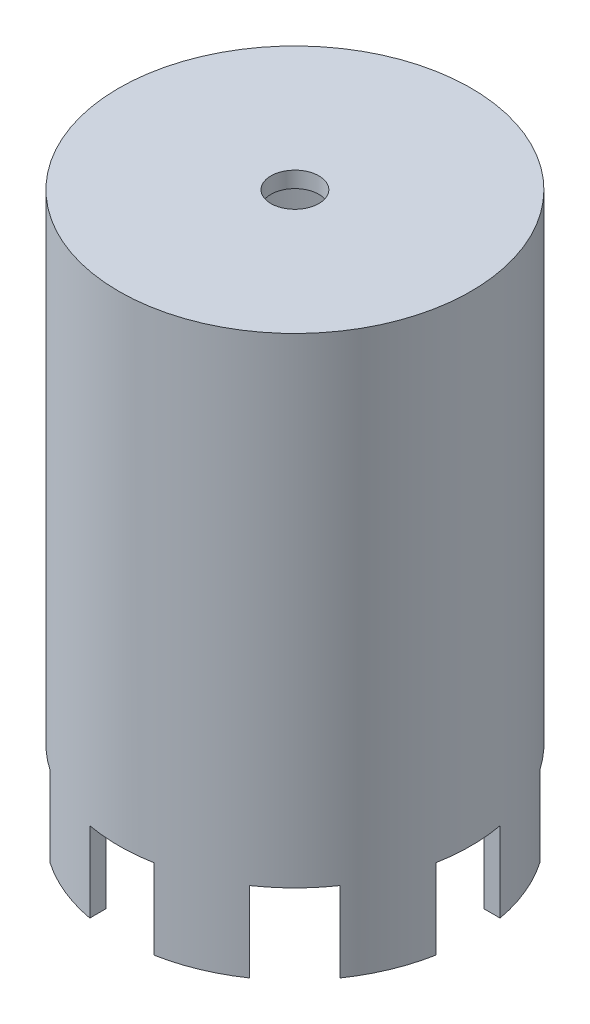
ISO-10303-21;
HEADER;
FILE_DESCRIPTION(('STEP AP214'),'2;1');
FILE_NAME('part.step','',(''),(''),'','','');
FILE_SCHEMA(('AUTOMOTIVE_DESIGN { 1 0 10303 214 1 1 1 1 }'));
ENDSEC;
DATA;
#1=APPLICATION_CONTEXT('core data for automotive mechanical design processes');
#2=APPLICATION_PROTOCOL_DEFINITION('international standard','automotive_design',2000,#1);
#3=PRODUCT_CONTEXT('',#1,'mechanical');
#4=PRODUCT('Part','Part','',(#3));
#5=PRODUCT_RELATED_PRODUCT_CATEGORY('part','',(#4));
#6=PRODUCT_DEFINITION_FORMATION('','',#4);
#7=PRODUCT_DEFINITION_CONTEXT('part definition',#1,'design');
#8=PRODUCT_DEFINITION('design','',#6,#7);
#9=PRODUCT_DEFINITION_SHAPE('','',#8);
#10=(LENGTH_UNIT() NAMED_UNIT(*) SI_UNIT(.MILLI.,.METRE.));
#11=(NAMED_UNIT(*) PLANE_ANGLE_UNIT() SI_UNIT($,.RADIAN.));
#12=(NAMED_UNIT(*) SI_UNIT($,.STERADIAN.) SOLID_ANGLE_UNIT());
#13=UNCERTAINTY_MEASURE_WITH_UNIT(LENGTH_MEASURE(1.E-05),#10,'distance_accuracy_value','');
#14=(GEOMETRIC_REPRESENTATION_CONTEXT(3) GLOBAL_UNCERTAINTY_ASSIGNED_CONTEXT((#13)) GLOBAL_UNIT_ASSIGNED_CONTEXT((#10,
#11,#12)) REPRESENTATION_CONTEXT('',''));
#15=CARTESIAN_POINT('',(0.,0.,0.));
#16=DIRECTION('',(0.,0.,1.));
#17=DIRECTION('',(1.,0.,0.));
#18=AXIS2_PLACEMENT_3D('',#15,#16,#17);
#19=CARTESIAN_POINT('',(0.,0.,0.));
#20=DIRECTION('',(0.,1.,0.));
#21=DIRECTION('',(0.,0.,1.));
#22=AXIS2_PLACEMENT_3D('',#19,#20,#21);
#23=PLANE('',#22);
#24=CARTESIAN_POINT('',(0.,0.,0.));
#25=DIRECTION('',(0.,1.,0.));
#26=DIRECTION('',(0.,0.,1.));
#27=AXIS2_PLACEMENT_3D('',#24,#25,#26);
#28=CIRCLE('',#27,10.);
#29=CARTESIAN_POINT('',(1.99999999999996,0.,9.79795897113272));
#30=VERTEX_POINT('',#29);
#31=CARTESIAN_POINT('',(5.51398966790239,0.,8.34241679264862));
#32=VERTEX_POINT('',#31);
#33=EDGE_CURVE('E270',#30,#32,#28,.T.);
#34=ORIENTED_EDGE('',*,*,#33,.T.);
#35=DIRECTION('',(0.707106781186546,0.,0.707106781186549));
#36=VECTOR('',#35,1.);
#37=CARTESIAN_POINT('',(-12.4142135623731,0.,-9.58578643762693));
#38=LINE('',#37,#36);
#39=CARTESIAN_POINT('',(6.23431570801606,0.,9.06274283276229));
#40=VERTEX_POINT('',#39);
#41=EDGE_CURVE('E248',#32,#40,#38,.T.);
#42=ORIENTED_EDGE('',*,*,#41,.T.);
#43=CARTESIAN_POINT('',(0.,0.,0.));
#44=DIRECTION('',(0.,1.,0.));
#45=DIRECTION('',(0.,0.,1.));
#46=AXIS2_PLACEMENT_3D('',#43,#44,#45);
#47=CIRCLE('',#46,11.);
#48=CARTESIAN_POINT('',(1.99999999999996,0.,10.816653826392));
#49=VERTEX_POINT('',#48);
#50=EDGE_CURVE('E482',#49,#40,#47,.T.);
#51=ORIENTED_EDGE('',*,*,#50,.F.);
#52=DIRECTION('',(0.,0.,1.));
#53=VECTOR('',#52,1.);
#54=CARTESIAN_POINT('',(2.00000000000003,0.,-11.));
#55=LINE('',#54,#53);
#56=EDGE_CURVE('E276',#30,#49,#55,.T.);
#57=ORIENTED_EDGE('',*,*,#56,.F.);
#58=EDGE_LOOP('',(#34,#42,#51,#57));
#59=FACE_BOUND('',#58,.T.);
#60=ADVANCED_FACE('F41',(#59),#23,.F.);
#61=CARTESIAN_POINT('',(-5.51398966790247,0.,8.34241679264858));
#62=VERTEX_POINT('',#61);
#63=CARTESIAN_POINT('',(-2.00000000000004,0.,9.7979589711327));
#64=VERTEX_POINT('',#63);
#65=EDGE_CURVE('E277',#62,#64,#28,.T.);
#66=ORIENTED_EDGE('',*,*,#65,.T.);
#67=DIRECTION('',(0.,0.,1.));
#68=VECTOR('',#67,1.);
#69=CARTESIAN_POINT('',(-1.99999999999997,0.,-11.0000000000001));
#70=LINE('',#69,#68);
#71=CARTESIAN_POINT('',(-2.00000000000004,0.,10.816653826392));
#72=VERTEX_POINT('',#71);
#73=EDGE_CURVE('E455',#64,#72,#70,.T.);
#74=ORIENTED_EDGE('',*,*,#73,.T.);
#75=CARTESIAN_POINT('',(-6.23431570801614,0.,9.06274283276225));
#76=VERTEX_POINT('',#75);
#77=EDGE_CURVE('E300',#76,#72,#47,.T.);
#78=ORIENTED_EDGE('',*,*,#77,.F.);
#79=DIRECTION('',(-0.707106781186551,0.,0.707106781186544));
#80=VECTOR('',#79,1.);
#81=CARTESIAN_POINT('',(12.4142135623731,0.,-9.58578643762684));
#82=LINE('',#81,#80);
#83=EDGE_CURVE('E435',#62,#76,#82,.T.);
#84=ORIENTED_EDGE('',*,*,#83,.F.);
#85=EDGE_LOOP('',(#66,#74,#78,#84));
#86=FACE_BOUND('',#85,.T.);
#87=ADVANCED_FACE('F512',(#86),#23,.F.);
#88=CARTESIAN_POINT('',(-9.79795897113271,0.,2.00000000000001));
#89=VERTEX_POINT('',#88);
#90=CARTESIAN_POINT('',(-8.34241679264864,0.,5.51398966790237));
#91=VERTEX_POINT('',#90);
#92=EDGE_CURVE('E281',#89,#91,#28,.T.);
#93=ORIENTED_EDGE('',*,*,#92,.T.);
#94=DIRECTION('',(-0.707106781186551,0.,0.707106781186544));
#95=VECTOR('',#94,1.);
#96=CARTESIAN_POINT('',(9.58578643762697,0.,-12.4142135623731));
#97=LINE('',#96,#95);
#98=CARTESIAN_POINT('',(-9.06274283276232,0.,6.23431570801604));
#99=VERTEX_POINT('',#98);
#100=EDGE_CURVE('E428',#91,#99,#97,.T.);
#101=ORIENTED_EDGE('',*,*,#100,.T.);
#102=CARTESIAN_POINT('',(-10.816653826392,0.,2.00000000000001));
#103=VERTEX_POINT('',#102);
#104=EDGE_CURVE('E296',#103,#99,#47,.T.);
#105=ORIENTED_EDGE('',*,*,#104,.F.);
#106=DIRECTION('',(1.,0.,0.));
#107=VECTOR('',#106,1.);
#108=CARTESIAN_POINT('',(-11.,0.,2.00000000000001));
#109=LINE('',#108,#107);
#110=EDGE_CURVE('E401',#103,#89,#109,.T.);
#111=ORIENTED_EDGE('',*,*,#110,.T.);
#112=EDGE_LOOP('',(#93,#101,#105,#111));
#113=FACE_BOUND('',#112,.T.);
#114=ADVANCED_FACE('F426',(#113),#23,.F.);
#115=CARTESIAN_POINT('',(-9.06274283276226,0.,-6.23431570801609));
#116=VERTEX_POINT('',#115);
#117=CARTESIAN_POINT('',(-10.816653826392,0.,-2.));
#118=VERTEX_POINT('',#117);
#119=EDGE_CURVE('E299',#116,#118,#47,.T.);
#120=ORIENTED_EDGE('',*,*,#119,.F.);
#121=CARTESIAN_POINT('',(-8.3424167926486,0.,-5.51398966790242));
#122=VERTEX_POINT('',#121);
#123=EDGE_CURVE('E260',#116,#122,#38,.T.);
#124=ORIENTED_EDGE('',*,*,#123,.T.);
#125=CARTESIAN_POINT('',(-9.79795897113271,0.,-2.));
#126=VERTEX_POINT('',#125);
#127=EDGE_CURVE('E288',#122,#126,#28,.T.);
#128=ORIENTED_EDGE('',*,*,#127,.T.);
#129=DIRECTION('',(1.,0.,0.));
#130=VECTOR('',#129,1.);
#131=CARTESIAN_POINT('',(-11.,0.,-2.));
#132=LINE('',#131,#130);
#133=EDGE_CURVE('E398',#118,#126,#132,.T.);
#134=ORIENTED_EDGE('',*,*,#133,.F.);
#135=EDGE_LOOP('',(#120,#124,#128,#134));
#136=FACE_BOUND('',#135,.T.);
#137=ADVANCED_FACE('F463',(#136),#23,.F.);
#138=CARTESIAN_POINT('',(9.79795897113271,0.,-2.));
#139=VERTEX_POINT('',#138);
#140=CARTESIAN_POINT('',(8.34241679264863,0.,-5.51398966790237));
#141=VERTEX_POINT('',#140);
#142=EDGE_CURVE('E282',#139,#141,#28,.T.);
#143=ORIENTED_EDGE('',*,*,#142,.T.);
#144=CARTESIAN_POINT('',(9.0627428327623,0.,-6.23431570801604));
#145=VERTEX_POINT('',#144);
#146=EDGE_CURVE('E441',#145,#141,#82,.T.);
#147=ORIENTED_EDGE('',*,*,#146,.F.);
#148=CARTESIAN_POINT('',(10.816653826392,0.,-2.));
#149=VERTEX_POINT('',#148);
#150=EDGE_CURVE('E295',#149,#145,#47,.T.);
#151=ORIENTED_EDGE('',*,*,#150,.F.);
#152=EDGE_CURVE('E399',#139,#149,#132,.T.);
#153=ORIENTED_EDGE('',*,*,#152,.F.);
#154=EDGE_LOOP('',(#143,#147,#151,#153));
#155=FACE_BOUND('',#154,.T.);
#156=ADVANCED_FACE('F498',(#155),#23,.F.);
#157=CARTESIAN_POINT('',(6.23431570801612,0.,-9.06274283276224));
#158=VERTEX_POINT('',#157);
#159=CARTESIAN_POINT('',(2.00000000000003,0.,-10.816653826392));
#160=VERTEX_POINT('',#159);
#161=EDGE_CURVE('E490',#158,#160,#47,.T.);
#162=ORIENTED_EDGE('',*,*,#161,.F.);
#163=CARTESIAN_POINT('',(5.51398966790245,0.,-8.34241679264858));
#164=VERTEX_POINT('',#163);
#165=EDGE_CURVE('E431',#158,#164,#97,.T.);
#166=ORIENTED_EDGE('',*,*,#165,.T.);
#167=CARTESIAN_POINT('',(2.00000000000003,0.,-9.79795897113271));
#168=VERTEX_POINT('',#167);
#169=EDGE_CURVE('E284',#164,#168,#28,.T.);
#170=ORIENTED_EDGE('',*,*,#169,.T.);
#171=EDGE_CURVE('E450',#160,#168,#55,.T.);
#172=ORIENTED_EDGE('',*,*,#171,.F.);
#173=EDGE_LOOP('',(#162,#166,#170,#172));
#174=FACE_BOUND('',#173,.T.);
#175=ADVANCED_FACE('F541',(#174),#23,.F.);
#176=CARTESIAN_POINT('',(9.06274283276226,0.,6.2343157080161));
#177=VERTEX_POINT('',#176);
#178=CARTESIAN_POINT('',(10.816653826392,0.,2.00000000000001));
#179=VERTEX_POINT('',#178);
#180=EDGE_CURVE('E301',#177,#179,#47,.T.);
#181=ORIENTED_EDGE('',*,*,#180,.F.);
#182=DIRECTION('',(0.707106781186546,0.,0.707106781186549));
#183=VECTOR('',#182,1.);
#184=CARTESIAN_POINT('',(-9.58578643762689,0.,-12.4142135623731));
#185=LINE('',#184,#183);
#186=CARTESIAN_POINT('',(8.34241679264859,0.,5.51398966790243));
#187=VERTEX_POINT('',#186);
#188=EDGE_CURVE('E458',#187,#177,#185,.T.);
#189=ORIENTED_EDGE('',*,*,#188,.F.);
#190=CARTESIAN_POINT('',(9.79795897113271,0.,2.00000000000001));
#191=VERTEX_POINT('',#190);
#192=EDGE_CURVE('E278',#187,#191,#28,.T.);
#193=ORIENTED_EDGE('',*,*,#192,.T.);
#194=EDGE_CURVE('E389',#191,#179,#109,.T.);
#195=ORIENTED_EDGE('',*,*,#194,.T.);
#196=EDGE_LOOP('',(#181,#189,#193,#195));
#197=FACE_BOUND('',#196,.T.);
#198=ADVANCED_FACE('F537',(#197),#23,.F.);
#199=CARTESIAN_POINT('',(0.,35.,0.));
#200=DIRECTION('',(0.,-1.,0.));
#201=DIRECTION('',(0.,0.,-1.));
#202=AXIS2_PLACEMENT_3D('',#199,#200,#201);
#203=CYLINDRICAL_SURFACE('',#202,11.);
#204=CARTESIAN_POINT('',(0.,35.,0.));
#205=DIRECTION('',(0.,1.,0.));
#206=DIRECTION('',(0.,0.,1.));
#207=AXIS2_PLACEMENT_3D('',#204,#205,#206);
#208=CIRCLE('',#207,11.);
#209=CARTESIAN_POINT('',(0.,35.,11.));
#210=VERTEX_POINT('',#209);
#211=EDGE_CURVE('E291',#210,#210,#208,.T.);
#212=ORIENTED_EDGE('',*,*,#211,.F.);
#213=EDGE_LOOP('',(#212));
#214=FACE_BOUND('',#213,.T.);
#215=CARTESIAN_POINT('',(0.,5.,0.));
#216=DIRECTION('',(0.,1.,0.));
#217=DIRECTION('',(0.,0.,1.));
#218=AXIS2_PLACEMENT_3D('',#215,#216,#217);
#219=CIRCLE('',#218,11.);
#220=CARTESIAN_POINT('',(-6.23431570801607,5.,-9.06274283276228));
#221=VERTEX_POINT('',#220);
#222=CARTESIAN_POINT('',(-9.06274283276227,5.,-6.23431570801609));
#223=VERTEX_POINT('',#222);
#224=EDGE_CURVE('E625',#221,#223,#219,.T.);
#225=ORIENTED_EDGE('',*,*,#224,.T.);
#226=DIRECTION('',(0.,-1.,0.));
#227=VECTOR('',#226,1.);
#228=CARTESIAN_POINT('',(-9.06274283276226,35.,-6.2343157080161));
#229=LINE('',#228,#227);
#230=EDGE_CURVE('E386',#223,#116,#229,.T.);
#231=ORIENTED_EDGE('',*,*,#230,.T.);
#232=ORIENTED_EDGE('',*,*,#119,.T.);
#233=DIRECTION('',(0.,-1.,0.));
#234=VECTOR('',#233,1.);
#235=CARTESIAN_POINT('',(-10.816653826392,35.,-1.99999999999999));
#236=LINE('',#235,#234);
#237=CARTESIAN_POINT('',(-10.816653826392,5.,-2.));
#238=VERTEX_POINT('',#237);
#239=EDGE_CURVE('E404',#118,#238,#236,.F.);
#240=ORIENTED_EDGE('',*,*,#239,.T.);
#241=CARTESIAN_POINT('',(0.,5.,0.));
#242=DIRECTION('',(0.,1.,0.));
#243=DIRECTION('',(0.,0.,1.));
#244=AXIS2_PLACEMENT_3D('',#241,#242,#243);
#245=CIRCLE('',#244,11.);
#246=CARTESIAN_POINT('',(-10.816653826392,5.,2.));
#247=VERTEX_POINT('',#246);
#248=EDGE_CURVE('E410',#238,#247,#245,.T.);
#249=ORIENTED_EDGE('',*,*,#248,.T.);
#250=DIRECTION('',(0.,-1.,0.));
#251=VECTOR('',#250,1.);
#252=CARTESIAN_POINT('',(-10.816653826392,35.,2.));
#253=LINE('',#252,#251);
#254=EDGE_CURVE('E283',#247,#103,#253,.T.);
#255=ORIENTED_EDGE('',*,*,#254,.T.);
#256=ORIENTED_EDGE('',*,*,#104,.T.);
#257=DIRECTION('',(0.,-1.,0.));
#258=VECTOR('',#257,1.);
#259=CARTESIAN_POINT('',(-9.06274283276231,35.,6.23431570801604));
#260=LINE('',#259,#258);
#261=CARTESIAN_POINT('',(-9.06274283276232,5.,6.23431570801604));
#262=VERTEX_POINT('',#261);
#263=EDGE_CURVE('E359',#99,#262,#260,.F.);
#264=ORIENTED_EDGE('',*,*,#263,.T.);
#265=CARTESIAN_POINT('',(-6.23431570801614,5.,9.06274283276224));
#266=VERTEX_POINT('',#265);
#267=EDGE_CURVE('E354',#262,#266,#219,.T.);
#268=ORIENTED_EDGE('',*,*,#267,.T.);
#269=DIRECTION('',(0.,-1.,0.));
#270=VECTOR('',#269,1.);
#271=CARTESIAN_POINT('',(-6.23431570801614,35.,9.06274283276223));
#272=LINE('',#271,#270);
#273=EDGE_CURVE('E356',#266,#76,#272,.T.);
#274=ORIENTED_EDGE('',*,*,#273,.T.);
#275=ORIENTED_EDGE('',*,*,#77,.T.);
#276=DIRECTION('',(0.,-1.,0.));
#277=VECTOR('',#276,1.);
#278=CARTESIAN_POINT('',(-2.00000000000004,35.,10.816653826392));
#279=LINE('',#278,#277);
#280=CARTESIAN_POINT('',(-2.00000000000004,5.,10.816653826392));
#281=VERTEX_POINT('',#280);
#282=EDGE_CURVE('E365',#72,#281,#279,.F.);
#283=ORIENTED_EDGE('',*,*,#282,.T.);
#284=CARTESIAN_POINT('',(1.99999999999996,5.,10.816653826392));
#285=VERTEX_POINT('',#284);
#286=EDGE_CURVE('E351',#281,#285,#219,.T.);
#287=ORIENTED_EDGE('',*,*,#286,.T.);
#288=DIRECTION('',(0.,-1.,0.));
#289=VECTOR('',#288,1.);
#290=CARTESIAN_POINT('',(1.99999999999995,35.,10.816653826392));
#291=LINE('',#290,#289);
#292=EDGE_CURVE('E362',#285,#49,#291,.T.);
#293=ORIENTED_EDGE('',*,*,#292,.T.);
#294=ORIENTED_EDGE('',*,*,#50,.T.);
#295=DIRECTION('',(0.,-1.,0.));
#296=VECTOR('',#295,1.);
#297=CARTESIAN_POINT('',(6.23431570801607,35.,9.06274283276228));
#298=LINE('',#297,#296);
#299=CARTESIAN_POINT('',(6.23431570801606,5.,9.06274283276229));
#300=VERTEX_POINT('',#299);
#301=EDGE_CURVE('E255',#40,#300,#298,.F.);
#302=ORIENTED_EDGE('',*,*,#301,.T.);
#303=CARTESIAN_POINT('',(9.06274283276227,5.,6.23431570801611));
#304=VERTEX_POINT('',#303);
#305=EDGE_CURVE('E626',#300,#304,#219,.T.);
#306=ORIENTED_EDGE('',*,*,#305,.T.);
#307=DIRECTION('',(0.,-1.,0.));
#308=VECTOR('',#307,1.);
#309=CARTESIAN_POINT('',(9.06274283276226,35.,6.23431570801611));
#310=LINE('',#309,#308);
#311=EDGE_CURVE('E380',#304,#177,#310,.T.);
#312=ORIENTED_EDGE('',*,*,#311,.T.);
#313=ORIENTED_EDGE('',*,*,#180,.T.);
#314=DIRECTION('',(0.,-1.,0.));
#315=VECTOR('',#314,1.);
#316=CARTESIAN_POINT('',(10.816653826392,35.,2.));
#317=LINE('',#316,#315);
#318=CARTESIAN_POINT('',(10.816653826392,5.,2.));
#319=VERTEX_POINT('',#318);
#320=EDGE_CURVE('E413',#179,#319,#317,.F.);
#321=ORIENTED_EDGE('',*,*,#320,.T.);
#322=CARTESIAN_POINT('',(10.816653826392,5.,-2.));
#323=VERTEX_POINT('',#322);
#324=EDGE_CURVE('E411',#319,#323,#245,.T.);
#325=ORIENTED_EDGE('',*,*,#324,.T.);
#326=DIRECTION('',(0.,-1.,0.));
#327=VECTOR('',#326,1.);
#328=CARTESIAN_POINT('',(10.816653826392,35.,-1.99999999999999));
#329=LINE('',#328,#327);
#330=EDGE_CURVE('E407',#323,#149,#329,.T.);
#331=ORIENTED_EDGE('',*,*,#330,.T.);
#332=ORIENTED_EDGE('',*,*,#150,.T.);
#333=DIRECTION('',(0.,-1.,0.));
#334=VECTOR('',#333,1.);
#335=CARTESIAN_POINT('',(9.0627428327623,35.,-6.23431570801604));
#336=LINE('',#335,#334);
#337=CARTESIAN_POINT('',(9.0627428327623,5.,-6.23431570801604));
#338=VERTEX_POINT('',#337);
#339=EDGE_CURVE('E377',#145,#338,#336,.F.);
#340=ORIENTED_EDGE('',*,*,#339,.T.);
#341=CARTESIAN_POINT('',(6.23431570801613,5.,-9.06274283276224));
#342=VERTEX_POINT('',#341);
#343=EDGE_CURVE('E355',#338,#342,#219,.T.);
#344=ORIENTED_EDGE('',*,*,#343,.T.);
#345=DIRECTION('',(0.,-1.,0.));
#346=VECTOR('',#345,1.);
#347=CARTESIAN_POINT('',(6.23431570801613,35.,-9.06274283276224));
#348=LINE('',#347,#346);
#349=EDGE_CURVE('E374',#342,#158,#348,.T.);
#350=ORIENTED_EDGE('',*,*,#349,.T.);
#351=ORIENTED_EDGE('',*,*,#161,.T.);
#352=DIRECTION('',(0.,-1.,0.));
#353=VECTOR('',#352,1.);
#354=CARTESIAN_POINT('',(2.00000000000003,35.,-10.816653826392));
#355=LINE('',#354,#353);
#356=CARTESIAN_POINT('',(2.00000000000003,5.,-10.816653826392));
#357=VERTEX_POINT('',#356);
#358=EDGE_CURVE('E371',#160,#357,#355,.F.);
#359=ORIENTED_EDGE('',*,*,#358,.T.);
#360=CARTESIAN_POINT('',(-1.99999999999997,5.,-10.816653826392));
#361=VERTEX_POINT('',#360);
#362=EDGE_CURVE('E623',#357,#361,#219,.T.);
#363=ORIENTED_EDGE('',*,*,#362,.T.);
#364=DIRECTION('',(0.,-1.,0.));
#365=VECTOR('',#364,1.);
#366=CARTESIAN_POINT('',(-1.99999999999996,35.,-10.816653826392));
#367=LINE('',#366,#365);
#368=CARTESIAN_POINT('',(-1.99999999999997,0.,-10.816653826392));
#369=VERTEX_POINT('',#368);
#370=EDGE_CURVE('E368',#361,#369,#367,.T.);
#371=ORIENTED_EDGE('',*,*,#370,.T.);
#372=CARTESIAN_POINT('',(-6.23431570801607,0.,-9.06274283276228));
#373=VERTEX_POINT('',#372);
#374=EDGE_CURVE('E487',#369,#373,#47,.T.);
#375=ORIENTED_EDGE('',*,*,#374,.T.);
#376=DIRECTION('',(0.,-1.,0.));
#377=VECTOR('',#376,1.);
#378=CARTESIAN_POINT('',(-6.23431570801608,35.,-9.06274283276228));
#379=LINE('',#378,#377);
#380=EDGE_CURVE('E384',#373,#221,#379,.F.);
#381=ORIENTED_EDGE('',*,*,#380,.T.);
#382=EDGE_LOOP('',(#225,#231,#232,#240,#249,#255,#256,#264,#268,#274,#275,#283,#287,#293,#294,
#302,#306,#312,#313,#321,#325,#331,#332,#340,#344,#350,#351,#359,#363,#371,#375,#381));
#383=FACE_BOUND('',#382,.T.);
#384=ADVANCED_FACE('F43',(#214,#383),#203,.T.);
#385=CARTESIAN_POINT('',(0.,35.,0.));
#386=DIRECTION('',(0.,1.,0.));
#387=DIRECTION('',(0.,0.,1.));
#388=AXIS2_PLACEMENT_3D('',#385,#386,#387);
#389=PLANE('',#388);
#390=CARTESIAN_POINT('',(0.,35.,0.));
#391=DIRECTION('',(0.,1.,0.));
#392=DIRECTION('',(0.,0.,1.));
#393=AXIS2_PLACEMENT_3D('',#390,#391,#392);
#394=CIRCLE('',#393,1.5);
#395=CARTESIAN_POINT('',(0.,35.,1.5));
#396=VERTEX_POINT('',#395);
#397=EDGE_CURVE('E437',#396,#396,#394,.T.);
#398=ORIENTED_EDGE('',*,*,#397,.F.);
#399=EDGE_LOOP('',(#398));
#400=FACE_BOUND('',#399,.T.);
#401=ORIENTED_EDGE('',*,*,#211,.T.);
#402=EDGE_LOOP('',(#401));
#403=FACE_BOUND('',#402,.T.);
#404=ADVANCED_FACE('F529',(#400,#403),#389,.T.);
#405=CARTESIAN_POINT('',(-1.99999999999997,0.,-9.79795897113272));
#406=VERTEX_POINT('',#405);
#407=CARTESIAN_POINT('',(-5.5139896679024,0.,-8.34241679264861));
#408=VERTEX_POINT('',#407);
#409=EDGE_CURVE('E469',#406,#408,#28,.T.);
#410=ORIENTED_EDGE('',*,*,#409,.T.);
#411=EDGE_CURVE('E334',#373,#408,#185,.T.);
#412=ORIENTED_EDGE('',*,*,#411,.F.);
#413=ORIENTED_EDGE('',*,*,#374,.F.);
#414=EDGE_CURVE('E452',#369,#406,#70,.T.);
#415=ORIENTED_EDGE('',*,*,#414,.T.);
#416=EDGE_LOOP('',(#410,#412,#413,#415));
#417=FACE_BOUND('',#416,.T.);
#418=ADVANCED_FACE('F532',(#417),#23,.F.);
#419=CARTESIAN_POINT('',(0.,35.,0.));
#420=DIRECTION('',(0.,-1.,0.));
#421=DIRECTION('',(0.,0.,-1.));
#422=AXIS2_PLACEMENT_3D('',#419,#420,#421);
#423=CYLINDRICAL_SURFACE('',#422,10.);
#424=DIRECTION('',(0.,-1.,0.));
#425=VECTOR('',#424,1.);
#426=CARTESIAN_POINT('',(-8.34241679264859,35.,-5.51398966790243));
#427=LINE('',#426,#425);
#428=CARTESIAN_POINT('',(-8.3424167926486,5.,-5.51398966790242));
#429=VERTEX_POINT('',#428);
#430=EDGE_CURVE('E11',#429,#122,#427,.T.);
#431=ORIENTED_EDGE('',*,*,#430,.F.);
#432=CARTESIAN_POINT('',(0.,5.,0.));
#433=DIRECTION('',(0.,1.,0.));
#434=DIRECTION('',(0.,0.,1.));
#435=AXIS2_PLACEMENT_3D('',#432,#433,#434);
#436=CIRCLE('',#435,10.);
#437=CARTESIAN_POINT('',(-5.5139896679024,5.,-8.34241679264861));
#438=VERTEX_POINT('',#437);
#439=EDGE_CURVE('E337',#438,#429,#436,.T.);
#440=ORIENTED_EDGE('',*,*,#439,.F.);
#441=DIRECTION('',(0.,-1.,0.));
#442=VECTOR('',#441,1.);
#443=CARTESIAN_POINT('',(-5.51398966790241,35.,-8.34241679264861));
#444=LINE('',#443,#442);
#445=EDGE_CURVE('E49',#408,#438,#444,.F.);
#446=ORIENTED_EDGE('',*,*,#445,.F.);
#447=ORIENTED_EDGE('',*,*,#409,.F.);
#448=DIRECTION('',(0.,-1.,0.));
#449=VECTOR('',#448,1.);
#450=CARTESIAN_POINT('',(-1.99999999999997,35.,-9.79795897113272));
#451=LINE('',#450,#449);
#452=CARTESIAN_POINT('',(-1.99999999999997,5.,-9.79795897113272));
#453=VERTEX_POINT('',#452);
#454=EDGE_CURVE('E320',#453,#406,#451,.T.);
#455=ORIENTED_EDGE('',*,*,#454,.F.);
#456=CARTESIAN_POINT('',(2.00000000000003,5.,-9.79795897113271));
#457=VERTEX_POINT('',#456);
#458=EDGE_CURVE('E341',#457,#453,#436,.T.);
#459=ORIENTED_EDGE('',*,*,#458,.F.);
#460=DIRECTION('',(0.,-1.,0.));
#461=VECTOR('',#460,1.);
#462=CARTESIAN_POINT('',(2.00000000000002,35.,-9.79795897113271));
#463=LINE('',#462,#461);
#464=EDGE_CURVE('E322',#168,#457,#463,.F.);
#465=ORIENTED_EDGE('',*,*,#464,.F.);
#466=ORIENTED_EDGE('',*,*,#169,.F.);
#467=DIRECTION('',(0.,-1.,0.));
#468=VECTOR('',#467,1.);
#469=CARTESIAN_POINT('',(5.51398966790246,35.,-8.34241679264858));
#470=LINE('',#469,#468);
#471=CARTESIAN_POINT('',(5.51398966790246,5.,-8.34241679264858));
#472=VERTEX_POINT('',#471);
#473=EDGE_CURVE('E324',#472,#164,#470,.T.);
#474=ORIENTED_EDGE('',*,*,#473,.F.);
#475=CARTESIAN_POINT('',(8.34241679264863,5.,-5.51398966790237));
#476=VERTEX_POINT('',#475);
#477=EDGE_CURVE('E344',#476,#472,#436,.T.);
#478=ORIENTED_EDGE('',*,*,#477,.F.);
#479=DIRECTION('',(0.,-1.,0.));
#480=VECTOR('',#479,1.);
#481=CARTESIAN_POINT('',(8.34241679264863,35.,-5.51398966790238));
#482=LINE('',#481,#480);
#483=EDGE_CURVE('E326',#141,#476,#482,.F.);
#484=ORIENTED_EDGE('',*,*,#483,.F.);
#485=ORIENTED_EDGE('',*,*,#142,.F.);
#486=DIRECTION('',(0.,-1.,0.));
#487=VECTOR('',#486,1.);
#488=CARTESIAN_POINT('',(9.79795897113271,35.,-1.99999999999999));
#489=LINE('',#488,#487);
#490=CARTESIAN_POINT('',(9.79795897113271,5.,-1.99999999999999));
#491=VERTEX_POINT('',#490);
#492=EDGE_CURVE('E308',#491,#139,#489,.T.);
#493=ORIENTED_EDGE('',*,*,#492,.F.);
#494=CARTESIAN_POINT('',(0.,5.,0.));
#495=DIRECTION('',(0.,1.,0.));
#496=DIRECTION('',(0.,0.,1.));
#497=AXIS2_PLACEMENT_3D('',#494,#495,#496);
#498=CIRCLE('',#497,10.);
#499=CARTESIAN_POINT('',(9.79795897113271,5.,2.));
#500=VERTEX_POINT('',#499);
#501=EDGE_CURVE('E306',#500,#491,#498,.T.);
#502=ORIENTED_EDGE('',*,*,#501,.F.);
#503=DIRECTION('',(0.,-1.,0.));
#504=VECTOR('',#503,1.);
#505=CARTESIAN_POINT('',(9.79795897113271,35.,2.));
#506=LINE('',#505,#504);
#507=EDGE_CURVE('E310',#191,#500,#506,.F.);
#508=ORIENTED_EDGE('',*,*,#507,.F.);
#509=ORIENTED_EDGE('',*,*,#192,.F.);
#510=DIRECTION('',(0.,-1.,0.));
#511=VECTOR('',#510,1.);
#512=CARTESIAN_POINT('',(8.34241679264859,35.,5.51398966790244));
#513=LINE('',#512,#511);
#514=CARTESIAN_POINT('',(8.34241679264859,5.,5.51398966790244));
#515=VERTEX_POINT('',#514);
#516=EDGE_CURVE('E273',#515,#187,#513,.T.);
#517=ORIENTED_EDGE('',*,*,#516,.F.);
#518=CARTESIAN_POINT('',(5.51398966790239,5.,8.34241679264862));
#519=VERTEX_POINT('',#518);
#520=EDGE_CURVE('E272',#519,#515,#436,.T.);
#521=ORIENTED_EDGE('',*,*,#520,.F.);
#522=DIRECTION('',(0.,-1.,0.));
#523=VECTOR('',#522,1.);
#524=CARTESIAN_POINT('',(5.5139896679024,35.,8.34241679264861));
#525=LINE('',#524,#523);
#526=EDGE_CURVE('E252',#32,#519,#525,.F.);
#527=ORIENTED_EDGE('',*,*,#526,.F.);
#528=ORIENTED_EDGE('',*,*,#33,.F.);
#529=DIRECTION('',(0.,-1.,0.));
#530=VECTOR('',#529,1.);
#531=CARTESIAN_POINT('',(1.99999999999996,35.,9.79795897113272));
#532=LINE('',#531,#530);
#533=CARTESIAN_POINT('',(1.99999999999996,5.,9.79795897113272));
#534=VERTEX_POINT('',#533);
#535=EDGE_CURVE('E316',#534,#30,#532,.T.);
#536=ORIENTED_EDGE('',*,*,#535,.F.);
#537=CARTESIAN_POINT('',(-2.00000000000004,5.,9.7979589711327));
#538=VERTEX_POINT('',#537);
#539=EDGE_CURVE('E346',#538,#534,#436,.T.);
#540=ORIENTED_EDGE('',*,*,#539,.F.);
#541=DIRECTION('',(0.,-1.,0.));
#542=VECTOR('',#541,1.);
#543=CARTESIAN_POINT('',(-2.00000000000003,35.,9.7979589711327));
#544=LINE('',#543,#542);
#545=EDGE_CURVE('E318',#64,#538,#544,.F.);
#546=ORIENTED_EDGE('',*,*,#545,.F.);
#547=ORIENTED_EDGE('',*,*,#65,.F.);
#548=DIRECTION('',(0.,-1.,0.));
#549=VECTOR('',#548,1.);
#550=CARTESIAN_POINT('',(-5.51398966790247,35.,8.34241679264857));
#551=LINE('',#550,#549);
#552=CARTESIAN_POINT('',(-5.51398966790247,5.,8.34241679264857));
#553=VERTEX_POINT('',#552);
#554=EDGE_CURVE('E312',#553,#62,#551,.T.);
#555=ORIENTED_EDGE('',*,*,#554,.F.);
#556=CARTESIAN_POINT('',(-8.34241679264864,5.,5.51398966790237));
#557=VERTEX_POINT('',#556);
#558=EDGE_CURVE('E345',#557,#553,#436,.T.);
#559=ORIENTED_EDGE('',*,*,#558,.F.);
#560=DIRECTION('',(0.,-1.,0.));
#561=VECTOR('',#560,1.);
#562=CARTESIAN_POINT('',(-8.34241679264863,35.,5.51398966790237));
#563=LINE('',#562,#561);
#564=EDGE_CURVE('E314',#91,#557,#563,.F.);
#565=ORIENTED_EDGE('',*,*,#564,.F.);
#566=ORIENTED_EDGE('',*,*,#92,.F.);
#567=DIRECTION('',(0.,-1.,0.));
#568=VECTOR('',#567,1.);
#569=CARTESIAN_POINT('',(-9.79795897113271,35.,2.));
#570=LINE('',#569,#568);
#571=CARTESIAN_POINT('',(-9.79795897113271,5.,2.));
#572=VERTEX_POINT('',#571);
#573=EDGE_CURVE('E305',#572,#89,#570,.T.);
#574=ORIENTED_EDGE('',*,*,#573,.F.);
#575=CARTESIAN_POINT('',(-9.79795897113271,5.,-2.));
#576=VERTEX_POINT('',#575);
#577=EDGE_CURVE('E303',#576,#572,#498,.T.);
#578=ORIENTED_EDGE('',*,*,#577,.F.);
#579=DIRECTION('',(0.,-1.,0.));
#580=VECTOR('',#579,1.);
#581=CARTESIAN_POINT('',(-9.79795897113271,35.,-1.99999999999999));
#582=LINE('',#581,#580);
#583=EDGE_CURVE('E294',#126,#576,#582,.F.);
#584=ORIENTED_EDGE('',*,*,#583,.F.);
#585=ORIENTED_EDGE('',*,*,#127,.F.);
#586=EDGE_LOOP('',(#431,#440,#446,#447,#455,#459,#465,#466,#474,#478,#484,#485,#493,#502,#508,
#509,#517,#521,#527,#528,#536,#540,#546,#547,#555,#559,#565,#566,#574,#578,#584,#585));
#587=FACE_BOUND('',#586,.T.);
#588=CARTESIAN_POINT('',(0.,34.,0.));
#589=DIRECTION('',(0.,1.,0.));
#590=DIRECTION('',(0.,0.,1.));
#591=AXIS2_PLACEMENT_3D('',#588,#589,#590);
#592=CIRCLE('',#591,10.);
#593=CARTESIAN_POINT('',(0.,34.,10.));
#594=VERTEX_POINT('',#593);
#595=EDGE_CURVE('E289',#594,#594,#592,.T.);
#596=ORIENTED_EDGE('',*,*,#595,.T.);
#597=EDGE_LOOP('',(#596));
#598=FACE_BOUND('',#597,.T.);
#599=ADVANCED_FACE('F267',(#587,#598),#423,.F.);
#600=CARTESIAN_POINT('',(0.,34.,0.));
#601=DIRECTION('',(0.,1.,0.));
#602=DIRECTION('',(0.,0.,1.));
#603=AXIS2_PLACEMENT_3D('',#600,#601,#602);
#604=PLANE('',#603);
#605=CARTESIAN_POINT('',(0.,34.,0.));
#606=DIRECTION('',(0.,1.,0.));
#607=DIRECTION('',(0.,0.,1.));
#608=AXIS2_PLACEMENT_3D('',#605,#606,#607);
#609=CIRCLE('',#608,1.5);
#610=CARTESIAN_POINT('',(0.,34.,1.5));
#611=VERTEX_POINT('',#610);
#612=EDGE_CURVE('E432',#611,#611,#609,.F.);
#613=ORIENTED_EDGE('',*,*,#612,.F.);
#614=EDGE_LOOP('',(#613));
#615=FACE_BOUND('',#614,.T.);
#616=ORIENTED_EDGE('',*,*,#595,.F.);
#617=EDGE_LOOP('',(#616));
#618=FACE_BOUND('',#617,.T.);
#619=ADVANCED_FACE('F551',(#615,#618),#604,.F.);
#620=CARTESIAN_POINT('',(-11.,0.,-2.));
#621=DIRECTION('',(0.,0.,-1.));
#622=DIRECTION('',(0.,1.,0.));
#623=AXIS2_PLACEMENT_3D('',#620,#621,#622);
#624=PLANE('',#623);
#625=ORIENTED_EDGE('',*,*,#133,.T.);
#626=ORIENTED_EDGE('',*,*,#583,.T.);
#627=DIRECTION('',(1.,0.,0.));
#628=VECTOR('',#627,1.);
#629=CARTESIAN_POINT('',(-11.,5.,-2.));
#630=LINE('',#629,#628);
#631=EDGE_CURVE('E394',#238,#576,#630,.T.);
#632=ORIENTED_EDGE('',*,*,#631,.F.);
#633=ORIENTED_EDGE('',*,*,#239,.F.);
#634=EDGE_LOOP('',(#625,#626,#632,#633));
#635=FACE_BOUND('',#634,.T.);
#636=ADVANCED_FACE('F556',(#635),#624,.F.);
#637=CARTESIAN_POINT('',(-11.,5.,2.));
#638=DIRECTION('',(0.,1.,0.));
#639=DIRECTION('',(0.,0.,1.));
#640=AXIS2_PLACEMENT_3D('',#637,#638,#639);
#641=PLANE('',#640);
#642=ORIENTED_EDGE('',*,*,#631,.T.);
#643=ORIENTED_EDGE('',*,*,#577,.T.);
#644=DIRECTION('',(1.,0.,0.));
#645=VECTOR('',#644,1.);
#646=CARTESIAN_POINT('',(-11.,5.,2.));
#647=LINE('',#646,#645);
#648=EDGE_CURVE('E393',#247,#572,#647,.T.);
#649=ORIENTED_EDGE('',*,*,#648,.F.);
#650=ORIENTED_EDGE('',*,*,#248,.F.);
#651=EDGE_LOOP('',(#642,#643,#649,#650));
#652=FACE_BOUND('',#651,.T.);
#653=ADVANCED_FACE('F564',(#652),#641,.F.);
#654=CARTESIAN_POINT('',(-11.,0.,2.00000000000001));
#655=DIRECTION('',(0.,0.,1.));
#656=DIRECTION('',(0.,-1.,0.));
#657=AXIS2_PLACEMENT_3D('',#654,#655,#656);
#658=PLANE('',#657);
#659=ORIENTED_EDGE('',*,*,#648,.T.);
#660=ORIENTED_EDGE('',*,*,#573,.T.);
#661=ORIENTED_EDGE('',*,*,#110,.F.);
#662=ORIENTED_EDGE('',*,*,#254,.F.);
#663=EDGE_LOOP('',(#659,#660,#661,#662));
#664=FACE_BOUND('',#663,.T.);
#665=ADVANCED_FACE('F560',(#664),#658,.F.);
#666=ORIENTED_EDGE('',*,*,#194,.F.);
#667=ORIENTED_EDGE('',*,*,#507,.T.);
#668=EDGE_CURVE('E390',#500,#319,#647,.T.);
#669=ORIENTED_EDGE('',*,*,#668,.T.);
#670=ORIENTED_EDGE('',*,*,#320,.F.);
#671=EDGE_LOOP('',(#666,#667,#669,#670));
#672=FACE_BOUND('',#671,.T.);
#673=ADVANCED_FACE('F563',(#672),#658,.F.);
#674=ORIENTED_EDGE('',*,*,#668,.F.);
#675=ORIENTED_EDGE('',*,*,#501,.T.);
#676=EDGE_CURVE('E395',#491,#323,#630,.T.);
#677=ORIENTED_EDGE('',*,*,#676,.T.);
#678=ORIENTED_EDGE('',*,*,#324,.F.);
#679=EDGE_LOOP('',(#674,#675,#677,#678));
#680=FACE_BOUND('',#679,.T.);
#681=ADVANCED_FACE('F568',(#680),#641,.F.);
#682=ORIENTED_EDGE('',*,*,#676,.F.);
#683=ORIENTED_EDGE('',*,*,#492,.T.);
#684=ORIENTED_EDGE('',*,*,#152,.T.);
#685=ORIENTED_EDGE('',*,*,#330,.F.);
#686=EDGE_LOOP('',(#682,#683,#684,#685));
#687=FACE_BOUND('',#686,.T.);
#688=ADVANCED_FACE('F565',(#687),#624,.F.);
#689=CARTESIAN_POINT('',(12.4142135623731,0.,-9.58578643762684));
#690=DIRECTION('',(0.707106781186544,0.,0.707106781186551));
#691=DIRECTION('',(0.707106781186551,0.,-0.707106781186544));
#692=AXIS2_PLACEMENT_3D('',#689,#690,#691);
#693=PLANE('',#692);
#694=DIRECTION('',(-0.707106781186551,0.,0.707106781186544));
#695=VECTOR('',#694,1.);
#696=CARTESIAN_POINT('',(12.4142135623731,5.,-9.58578643762684));
#697=LINE('',#696,#695);
#698=EDGE_CURVE('E501',#553,#266,#697,.T.);
#699=ORIENTED_EDGE('',*,*,#698,.F.);
#700=ORIENTED_EDGE('',*,*,#554,.T.);
#701=ORIENTED_EDGE('',*,*,#83,.T.);
#702=ORIENTED_EDGE('',*,*,#273,.F.);
#703=EDGE_LOOP('',(#699,#700,#701,#702));
#704=FACE_BOUND('',#703,.T.);
#705=ADVANCED_FACE('F506',(#704),#693,.F.);
#706=CARTESIAN_POINT('',(9.58578643762697,0.,-12.4142135623731));
#707=DIRECTION('',(-0.707106781186544,0.,-0.707106781186551));
#708=DIRECTION('',(-0.707106781186551,0.,0.707106781186544));
#709=AXIS2_PLACEMENT_3D('',#706,#707,#708);
#710=PLANE('',#709);
#711=ORIENTED_EDGE('',*,*,#100,.F.);
#712=ORIENTED_EDGE('',*,*,#564,.T.);
#713=DIRECTION('',(-0.707106781186551,0.,0.707106781186544));
#714=VECTOR('',#713,1.);
#715=CARTESIAN_POINT('',(9.58578643762697,5.,-12.4142135623731));
#716=LINE('',#715,#714);
#717=EDGE_CURVE('E516',#557,#262,#716,.T.);
#718=ORIENTED_EDGE('',*,*,#717,.T.);
#719=ORIENTED_EDGE('',*,*,#263,.F.);
#720=EDGE_LOOP('',(#711,#712,#718,#719));
#721=FACE_BOUND('',#720,.T.);
#722=ADVANCED_FACE('F600',(#721),#710,.F.);
#723=CARTESIAN_POINT('',(-12.4142135623731,5.,-9.58578643762693));
#724=DIRECTION('',(0.,1.,0.));
#725=DIRECTION('',(0.,0.,1.));
#726=AXIS2_PLACEMENT_3D('',#723,#724,#725);
#727=PLANE('',#726);
#728=ORIENTED_EDGE('',*,*,#717,.F.);
#729=ORIENTED_EDGE('',*,*,#558,.T.);
#730=ORIENTED_EDGE('',*,*,#698,.T.);
#731=ORIENTED_EDGE('',*,*,#267,.F.);
#732=EDGE_LOOP('',(#728,#729,#730,#731));
#733=FACE_BOUND('',#732,.T.);
#734=ADVANCED_FACE('F612',(#733),#727,.F.);
#735=CARTESIAN_POINT('',(2.00000000000003,0.,-11.));
#736=DIRECTION('',(1.,0.,0.));
#737=DIRECTION('',(0.,0.,-1.));
#738=AXIS2_PLACEMENT_3D('',#735,#736,#737);
#739=PLANE('',#738);
#740=DIRECTION('',(0.,0.,1.));
#741=VECTOR('',#740,1.);
#742=CARTESIAN_POINT('',(2.00000000000003,5.,-11.));
#743=LINE('',#742,#741);
#744=EDGE_CURVE('E447',#534,#285,#743,.T.);
#745=ORIENTED_EDGE('',*,*,#744,.F.);
#746=ORIENTED_EDGE('',*,*,#535,.T.);
#747=ORIENTED_EDGE('',*,*,#56,.T.);
#748=ORIENTED_EDGE('',*,*,#292,.F.);
#749=EDGE_LOOP('',(#745,#746,#747,#748));
#750=FACE_BOUND('',#749,.T.);
#751=ADVANCED_FACE('F596',(#750),#739,.F.);
#752=CARTESIAN_POINT('',(-1.99999999999997,0.,-11.0000000000001));
#753=DIRECTION('',(-1.,0.,0.));
#754=DIRECTION('',(0.,0.,1.));
#755=AXIS2_PLACEMENT_3D('',#752,#753,#754);
#756=PLANE('',#755);
#757=ORIENTED_EDGE('',*,*,#73,.F.);
#758=ORIENTED_EDGE('',*,*,#545,.T.);
#759=DIRECTION('',(0.,0.,1.));
#760=VECTOR('',#759,1.);
#761=CARTESIAN_POINT('',(-1.99999999999997,5.,-11.0000000000001));
#762=LINE('',#761,#760);
#763=EDGE_CURVE('E443',#538,#281,#762,.T.);
#764=ORIENTED_EDGE('',*,*,#763,.T.);
#765=ORIENTED_EDGE('',*,*,#282,.F.);
#766=EDGE_LOOP('',(#757,#758,#764,#765));
#767=FACE_BOUND('',#766,.T.);
#768=ADVANCED_FACE('F592',(#767),#756,.F.);
#769=ORIENTED_EDGE('',*,*,#763,.F.);
#770=ORIENTED_EDGE('',*,*,#539,.T.);
#771=ORIENTED_EDGE('',*,*,#744,.T.);
#772=ORIENTED_EDGE('',*,*,#286,.F.);
#773=EDGE_LOOP('',(#769,#770,#771,#772));
#774=FACE_BOUND('',#773,.T.);
#775=ADVANCED_FACE('F586',(#774),#727,.F.);
#776=EDGE_CURVE('E261',#361,#453,#762,.T.);
#777=ORIENTED_EDGE('',*,*,#776,.T.);
#778=ORIENTED_EDGE('',*,*,#454,.T.);
#779=ORIENTED_EDGE('',*,*,#414,.F.);
#780=ORIENTED_EDGE('',*,*,#370,.F.);
#781=EDGE_LOOP('',(#777,#778,#779,#780));
#782=FACE_BOUND('',#781,.T.);
#783=ADVANCED_FACE('F587',(#782),#756,.F.);
#784=ORIENTED_EDGE('',*,*,#171,.T.);
#785=ORIENTED_EDGE('',*,*,#464,.T.);
#786=EDGE_CURVE('E446',#357,#457,#743,.T.);
#787=ORIENTED_EDGE('',*,*,#786,.F.);
#788=ORIENTED_EDGE('',*,*,#358,.F.);
#789=EDGE_LOOP('',(#784,#785,#787,#788));
#790=FACE_BOUND('',#789,.T.);
#791=ADVANCED_FACE('F590',(#790),#739,.F.);
#792=ORIENTED_EDGE('',*,*,#786,.T.);
#793=ORIENTED_EDGE('',*,*,#458,.T.);
#794=ORIENTED_EDGE('',*,*,#776,.F.);
#795=ORIENTED_EDGE('',*,*,#362,.F.);
#796=EDGE_LOOP('',(#792,#793,#794,#795));
#797=FACE_BOUND('',#796,.T.);
#798=ADVANCED_FACE('F585',(#797),#727,.F.);
#799=EDGE_CURVE('E515',#342,#472,#716,.T.);
#800=ORIENTED_EDGE('',*,*,#799,.T.);
#801=ORIENTED_EDGE('',*,*,#473,.T.);
#802=ORIENTED_EDGE('',*,*,#165,.F.);
#803=ORIENTED_EDGE('',*,*,#349,.F.);
#804=EDGE_LOOP('',(#800,#801,#802,#803));
#805=FACE_BOUND('',#804,.T.);
#806=ADVANCED_FACE('F597',(#805),#710,.F.);
#807=ORIENTED_EDGE('',*,*,#146,.T.);
#808=ORIENTED_EDGE('',*,*,#483,.T.);
#809=EDGE_CURVE('E503',#338,#476,#697,.T.);
#810=ORIENTED_EDGE('',*,*,#809,.F.);
#811=ORIENTED_EDGE('',*,*,#339,.F.);
#812=EDGE_LOOP('',(#807,#808,#810,#811));
#813=FACE_BOUND('',#812,.T.);
#814=ADVANCED_FACE('F583',(#813),#693,.F.);
#815=ORIENTED_EDGE('',*,*,#809,.T.);
#816=ORIENTED_EDGE('',*,*,#477,.T.);
#817=ORIENTED_EDGE('',*,*,#799,.F.);
#818=ORIENTED_EDGE('',*,*,#343,.F.);
#819=EDGE_LOOP('',(#815,#816,#817,#818));
#820=FACE_BOUND('',#819,.T.);
#821=ADVANCED_FACE('F580',(#820),#727,.F.);
#822=CARTESIAN_POINT('',(-9.58578643762689,0.,-12.4142135623731));
#823=DIRECTION('',(0.707106781186549,0.,-0.707106781186546));
#824=DIRECTION('',(-0.707106781186546,0.,-0.707106781186549));
#825=AXIS2_PLACEMENT_3D('',#822,#823,#824);
#826=PLANE('',#825);
#827=DIRECTION('',(0.707106781186546,0.,0.707106781186549));
#828=VECTOR('',#827,1.);
#829=CARTESIAN_POINT('',(-9.58578643762689,5.,-12.4142135623731));
#830=LINE('',#829,#828);
#831=EDGE_CURVE('E64',#515,#304,#830,.T.);
#832=ORIENTED_EDGE('',*,*,#831,.F.);
#833=ORIENTED_EDGE('',*,*,#516,.T.);
#834=ORIENTED_EDGE('',*,*,#188,.T.);
#835=ORIENTED_EDGE('',*,*,#311,.F.);
#836=EDGE_LOOP('',(#832,#833,#834,#835));
#837=FACE_BOUND('',#836,.T.);
#838=ADVANCED_FACE('F579',(#837),#826,.F.);
#839=DIRECTION('',(0.707106781186546,0.,0.707106781186549));
#840=VECTOR('',#839,1.);
#841=CARTESIAN_POINT('',(-12.4142135623731,5.,-9.58578643762693));
#842=LINE('',#841,#840);
#843=EDGE_CURVE('E456',#519,#300,#842,.T.);
#844=ORIENTED_EDGE('',*,*,#843,.F.);
#845=ORIENTED_EDGE('',*,*,#520,.T.);
#846=ORIENTED_EDGE('',*,*,#831,.T.);
#847=ORIENTED_EDGE('',*,*,#305,.F.);
#848=EDGE_LOOP('',(#844,#845,#846,#847));
#849=FACE_BOUND('',#848,.T.);
#850=ADVANCED_FACE('F607',(#849),#727,.F.);
#851=CARTESIAN_POINT('',(-12.4142135623731,0.,-9.58578643762693));
#852=DIRECTION('',(-0.707106781186549,0.,0.707106781186546));
#853=DIRECTION('',(0.707106781186546,0.,0.707106781186549));
#854=AXIS2_PLACEMENT_3D('',#851,#852,#853);
#855=PLANE('',#854);
#856=ORIENTED_EDGE('',*,*,#41,.F.);
#857=ORIENTED_EDGE('',*,*,#526,.T.);
#858=ORIENTED_EDGE('',*,*,#843,.T.);
#859=ORIENTED_EDGE('',*,*,#301,.F.);
#860=EDGE_LOOP('',(#856,#857,#858,#859));
#861=FACE_BOUND('',#860,.T.);
#862=ADVANCED_FACE('F250',(#861),#855,.F.);
#863=EDGE_CURVE('E349',#223,#429,#842,.T.);
#864=ORIENTED_EDGE('',*,*,#863,.T.);
#865=ORIENTED_EDGE('',*,*,#430,.T.);
#866=ORIENTED_EDGE('',*,*,#123,.F.);
#867=ORIENTED_EDGE('',*,*,#230,.F.);
#868=EDGE_LOOP('',(#864,#865,#866,#867));
#869=FACE_BOUND('',#868,.T.);
#870=ADVANCED_FACE('F573',(#869),#855,.F.);
#871=ORIENTED_EDGE('',*,*,#411,.T.);
#872=ORIENTED_EDGE('',*,*,#445,.T.);
#873=EDGE_CURVE('E56',#221,#438,#830,.T.);
#874=ORIENTED_EDGE('',*,*,#873,.F.);
#875=ORIENTED_EDGE('',*,*,#380,.F.);
#876=EDGE_LOOP('',(#871,#872,#874,#875));
#877=FACE_BOUND('',#876,.T.);
#878=ADVANCED_FACE('F331',(#877),#826,.F.);
#879=ORIENTED_EDGE('',*,*,#873,.T.);
#880=ORIENTED_EDGE('',*,*,#439,.T.);
#881=ORIENTED_EDGE('',*,*,#863,.F.);
#882=ORIENTED_EDGE('',*,*,#224,.F.);
#883=EDGE_LOOP('',(#879,#880,#881,#882));
#884=FACE_BOUND('',#883,.T.);
#885=ADVANCED_FACE('F578',(#884),#727,.F.);
#886=CARTESIAN_POINT('',(0.,-0.001000000000001,0.));
#887=DIRECTION('',(0.,1.,0.));
#888=DIRECTION('',(0.,0.,1.));
#889=AXIS2_PLACEMENT_3D('',#886,#887,#888);
#890=CYLINDRICAL_SURFACE('',#889,1.5);
#891=ORIENTED_EDGE('',*,*,#397,.T.);
#892=EDGE_LOOP('',(#891));
#893=FACE_BOUND('',#892,.T.);
#894=ORIENTED_EDGE('',*,*,#612,.T.);
#895=EDGE_LOOP('',(#894));
#896=FACE_BOUND('',#895,.T.);
#897=ADVANCED_FACE('F526',(#893,#896),#890,.F.);
#898=CLOSED_SHELL('',(#60,#87,#114,#137,#156,#175,#198,#384,#404,#418,#599,#619,#636,#653,#665,
#673,#681,#688,#705,#722,#734,#751,#768,#775,#783,#791,#798,#806,#814,#821,#838,#850,#862,#870,
#878,#885,#897));
#899=MANIFOLD_SOLID_BREP('B2',#898);
#900=ADVANCED_BREP_SHAPE_REPRESENTATION('',(#18,#899),#14);
#901=SHAPE_DEFINITION_REPRESENTATION(#9,#900);
ENDSEC;
END-ISO-10303-21;
